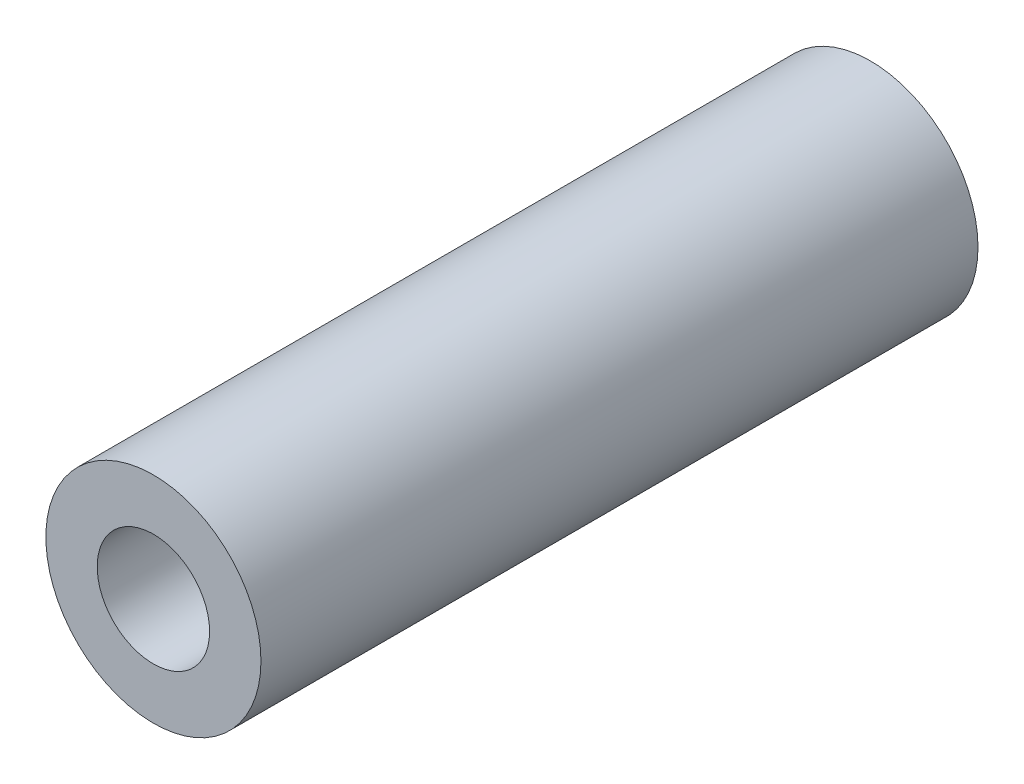
ISO-10303-21;
HEADER;
FILE_DESCRIPTION(('STEP AP214'),'2;1');
FILE_NAME('part.step','',(''),(''),'','','');
FILE_SCHEMA(('AUTOMOTIVE_DESIGN { 1 0 10303 214 1 1 1 1 }'));
ENDSEC;
DATA;
#1=APPLICATION_CONTEXT('core data for automotive mechanical design processes');
#2=APPLICATION_PROTOCOL_DEFINITION('international standard','automotive_design',2000,#1);
#3=PRODUCT_CONTEXT('',#1,'mechanical');
#4=PRODUCT('Part','Part','',(#3));
#5=PRODUCT_RELATED_PRODUCT_CATEGORY('part','',(#4));
#6=PRODUCT_DEFINITION_FORMATION('','',#4);
#7=PRODUCT_DEFINITION_CONTEXT('part definition',#1,'design');
#8=PRODUCT_DEFINITION('design','',#6,#7);
#9=PRODUCT_DEFINITION_SHAPE('','',#8);
#10=(LENGTH_UNIT() NAMED_UNIT(*) SI_UNIT(.MILLI.,.METRE.));
#11=(NAMED_UNIT(*) PLANE_ANGLE_UNIT() SI_UNIT($,.RADIAN.));
#12=(NAMED_UNIT(*) SI_UNIT($,.STERADIAN.) SOLID_ANGLE_UNIT());
#13=UNCERTAINTY_MEASURE_WITH_UNIT(LENGTH_MEASURE(1.E-05),#10,'distance_accuracy_value','');
#14=(GEOMETRIC_REPRESENTATION_CONTEXT(3) GLOBAL_UNCERTAINTY_ASSIGNED_CONTEXT((#13)) GLOBAL_UNIT_ASSIGNED_CONTEXT((#10,
#11,#12)) REPRESENTATION_CONTEXT('',''));
#15=CARTESIAN_POINT('',(0.,0.,0.));
#16=DIRECTION('',(0.,0.,1.));
#17=DIRECTION('',(1.,0.,0.));
#18=AXIS2_PLACEMENT_3D('',#15,#16,#17);
#19=CARTESIAN_POINT('',(0.,0.,15.875));
#20=DIRECTION('',(0.,0.,1.));
#21=DIRECTION('',(1.,0.,0.));
#22=AXIS2_PLACEMENT_3D('',#19,#20,#21);
#23=PLANE('',#22);
#24=CARTESIAN_POINT('',(0.,0.,15.875));
#25=DIRECTION('',(0.,0.,1.));
#26=DIRECTION('',(1.,0.,0.));
#27=AXIS2_PLACEMENT_3D('',#24,#25,#26);
#28=CIRCLE('',#27,4.7625);
#29=CARTESIAN_POINT('',(4.7625,0.,15.875));
#30=VERTEX_POINT('',#29);
#31=EDGE_CURVE('E10',#30,#30,#28,.T.);
#32=ORIENTED_EDGE('',*,*,#31,.T.);
#33=EDGE_LOOP('',(#32));
#34=FACE_BOUND('',#33,.T.);
#35=CARTESIAN_POINT('',(0.,0.,15.875));
#36=DIRECTION('',(0.,0.,1.));
#37=DIRECTION('',(1.,0.,0.));
#38=AXIS2_PLACEMENT_3D('',#35,#36,#37);
#39=CIRCLE('',#38,2.4892);
#40=CARTESIAN_POINT('',(2.4892,0.,15.875));
#41=VERTEX_POINT('',#40);
#42=EDGE_CURVE('E56',#41,#41,#39,.T.);
#43=ORIENTED_EDGE('',*,*,#42,.F.);
#44=EDGE_LOOP('',(#43));
#45=FACE_BOUND('',#44,.T.);
#46=ADVANCED_FACE('F43',(#34,#45),#23,.T.);
#47=CARTESIAN_POINT('',(0.,0.,-15.875));
#48=DIRECTION('',(0.,0.,1.));
#49=DIRECTION('',(1.,0.,0.));
#50=AXIS2_PLACEMENT_3D('',#47,#48,#49);
#51=PLANE('',#50);
#52=CARTESIAN_POINT('',(0.,0.,-15.875));
#53=DIRECTION('',(0.,0.,1.));
#54=DIRECTION('',(1.,0.,0.));
#55=AXIS2_PLACEMENT_3D('',#52,#53,#54);
#56=CIRCLE('',#55,4.7625);
#57=CARTESIAN_POINT('',(4.7625,0.,-15.875));
#58=VERTEX_POINT('',#57);
#59=EDGE_CURVE('E47',#58,#58,#56,.T.);
#60=ORIENTED_EDGE('',*,*,#59,.F.);
#61=EDGE_LOOP('',(#60));
#62=FACE_BOUND('',#61,.T.);
#63=CARTESIAN_POINT('',(0.,0.,-15.875));
#64=DIRECTION('',(0.,0.,1.));
#65=DIRECTION('',(1.,0.,0.));
#66=AXIS2_PLACEMENT_3D('',#63,#64,#65);
#67=CIRCLE('',#66,2.4892);
#68=CARTESIAN_POINT('',(2.4892,0.,-15.875));
#69=VERTEX_POINT('',#68);
#70=EDGE_CURVE('E58',#69,#69,#67,.T.);
#71=ORIENTED_EDGE('',*,*,#70,.T.);
#72=EDGE_LOOP('',(#71));
#73=FACE_BOUND('',#72,.T.);
#74=ADVANCED_FACE('F70',(#62,#73),#51,.F.);
#75=CARTESIAN_POINT('',(0.,0.,15.875));
#76=DIRECTION('',(0.,0.,-1.));
#77=DIRECTION('',(-1.,0.,0.));
#78=AXIS2_PLACEMENT_3D('',#75,#76,#77);
#79=CYLINDRICAL_SURFACE('',#78,4.7625);
#80=ORIENTED_EDGE('',*,*,#31,.F.);
#81=EDGE_LOOP('',(#80));
#82=FACE_BOUND('',#81,.T.);
#83=ORIENTED_EDGE('',*,*,#59,.T.);
#84=EDGE_LOOP('',(#83));
#85=FACE_BOUND('',#84,.T.);
#86=ADVANCED_FACE('F45',(#82,#85),#79,.T.);
#87=CARTESIAN_POINT('',(0.,0.,15.875));
#88=DIRECTION('',(0.,0.,-1.));
#89=DIRECTION('',(-1.,0.,0.));
#90=AXIS2_PLACEMENT_3D('',#87,#88,#89);
#91=CYLINDRICAL_SURFACE('',#90,2.4892);
#92=ORIENTED_EDGE('',*,*,#42,.T.);
#93=EDGE_LOOP('',(#92));
#94=FACE_BOUND('',#93,.T.);
#95=ORIENTED_EDGE('',*,*,#70,.F.);
#96=EDGE_LOOP('',(#95));
#97=FACE_BOUND('',#96,.T.);
#98=ADVANCED_FACE('F66',(#94,#97),#91,.F.);
#99=CLOSED_SHELL('',(#46,#74,#86,#98));
#100=MANIFOLD_SOLID_BREP('B2',#99);
#101=ADVANCED_BREP_SHAPE_REPRESENTATION('',(#18,#100),#14);
#102=SHAPE_DEFINITION_REPRESENTATION(#9,#101);
ENDSEC;
END-ISO-10303-21;
